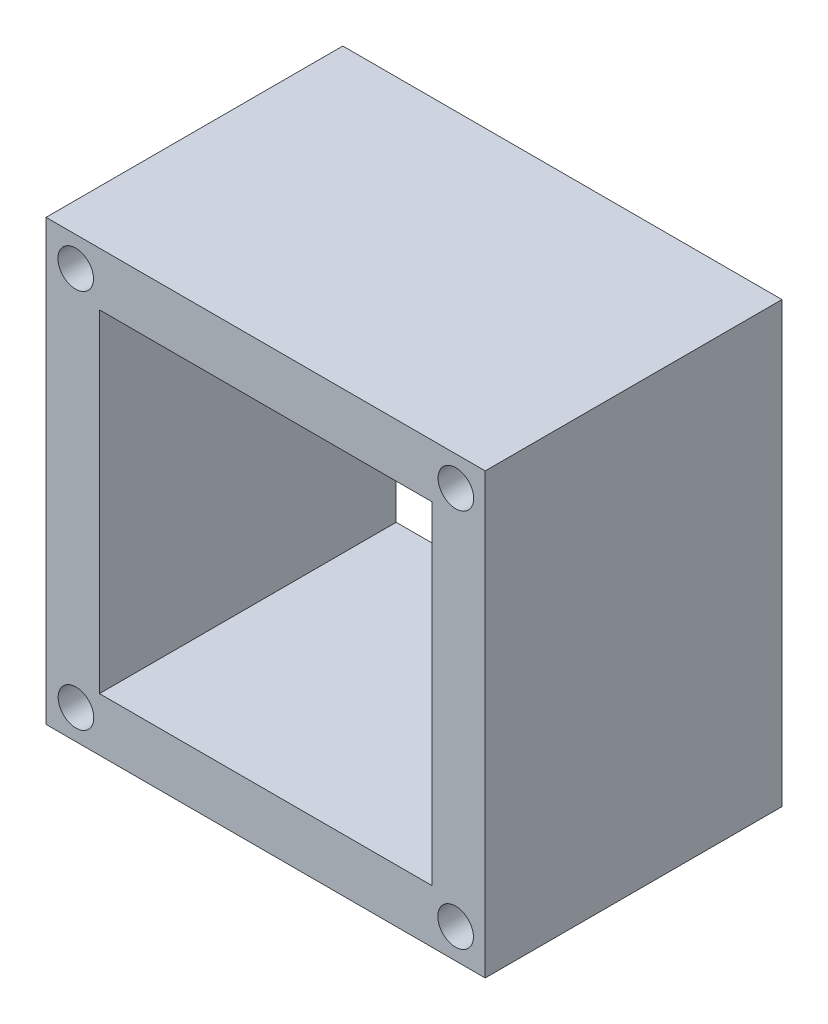
ISO-10303-21;
HEADER;
FILE_DESCRIPTION(('STEP AP214'),'2;1');
FILE_NAME('part.step','',(''),(''),'','','');
FILE_SCHEMA(('AUTOMOTIVE_DESIGN { 1 0 10303 214 1 1 1 1 }'));
ENDSEC;
DATA;
#1=APPLICATION_CONTEXT('core data for automotive mechanical design processes');
#2=APPLICATION_PROTOCOL_DEFINITION('international standard','automotive_design',2000,#1);
#3=PRODUCT_CONTEXT('',#1,'mechanical');
#4=PRODUCT('Part','Part','',(#3));
#5=PRODUCT_RELATED_PRODUCT_CATEGORY('part','',(#4));
#6=PRODUCT_DEFINITION_FORMATION('','',#4);
#7=PRODUCT_DEFINITION_CONTEXT('part definition',#1,'design');
#8=PRODUCT_DEFINITION('design','',#6,#7);
#9=PRODUCT_DEFINITION_SHAPE('','',#8);
#10=(LENGTH_UNIT() NAMED_UNIT(*) SI_UNIT(.MILLI.,.METRE.));
#11=(NAMED_UNIT(*) PLANE_ANGLE_UNIT() SI_UNIT($,.RADIAN.));
#12=(NAMED_UNIT(*) SI_UNIT($,.STERADIAN.) SOLID_ANGLE_UNIT());
#13=UNCERTAINTY_MEASURE_WITH_UNIT(LENGTH_MEASURE(1.E-05),#10,'distance_accuracy_value','');
#14=(GEOMETRIC_REPRESENTATION_CONTEXT(3) GLOBAL_UNCERTAINTY_ASSIGNED_CONTEXT((#13)) GLOBAL_UNIT_ASSIGNED_CONTEXT((#10,
#11,#12)) REPRESENTATION_CONTEXT('',''));
#15=CARTESIAN_POINT('',(0.,0.,0.));
#16=DIRECTION('',(0.,0.,1.));
#17=DIRECTION('',(1.,0.,0.));
#18=AXIS2_PLACEMENT_3D('',#15,#16,#17);
#19=CARTESIAN_POINT('',(-18.5,18.5,25.));
#20=DIRECTION('',(1.,0.,0.));
#21=DIRECTION('',(0.,1.,0.));
#22=AXIS2_PLACEMENT_3D('',#19,#20,#21);
#23=PLANE('',#22);
#24=DIRECTION('',(0.,-1.,0.));
#25=VECTOR('',#24,1.);
#26=CARTESIAN_POINT('',(-18.5,18.5,0.));
#27=LINE('',#26,#25);
#28=CARTESIAN_POINT('',(-18.5,18.5,0.));
#29=VERTEX_POINT('',#28);
#30=CARTESIAN_POINT('',(-18.5,-18.5,0.));
#31=VERTEX_POINT('',#30);
#32=EDGE_CURVE('E138',#29,#31,#27,.T.);
#33=ORIENTED_EDGE('',*,*,#32,.T.);
#34=DIRECTION('',(0.,0.,-1.));
#35=VECTOR('',#34,1.);
#36=CARTESIAN_POINT('',(-18.5,-18.5,25.));
#37=LINE('',#36,#35);
#38=CARTESIAN_POINT('',(-18.5,-18.5,25.));
#39=VERTEX_POINT('',#38);
#40=EDGE_CURVE('E11',#39,#31,#37,.T.);
#41=ORIENTED_EDGE('',*,*,#40,.F.);
#42=DIRECTION('',(0.,-1.,0.));
#43=VECTOR('',#42,1.);
#44=CARTESIAN_POINT('',(-18.5,18.5,25.));
#45=LINE('',#44,#43);
#46=CARTESIAN_POINT('',(-18.5,18.5,25.));
#47=VERTEX_POINT('',#46);
#48=EDGE_CURVE('E142',#47,#39,#45,.T.);
#49=ORIENTED_EDGE('',*,*,#48,.F.);
#50=DIRECTION('',(0.,0.,-1.));
#51=VECTOR('',#50,1.);
#52=CARTESIAN_POINT('',(-18.5,18.5,25.));
#53=LINE('',#52,#51);
#54=EDGE_CURVE('E154',#47,#29,#53,.T.);
#55=ORIENTED_EDGE('',*,*,#54,.T.);
#56=EDGE_LOOP('',(#33,#41,#49,#55));
#57=FACE_BOUND('',#56,.T.);
#58=ADVANCED_FACE('F37',(#57),#23,.F.);
#59=CARTESIAN_POINT('',(-18.5,-18.5,25.));
#60=DIRECTION('',(0.,1.,0.));
#61=DIRECTION('',(0.,0.,1.));
#62=AXIS2_PLACEMENT_3D('',#59,#60,#61);
#63=PLANE('',#62);
#64=DIRECTION('',(1.,0.,0.));
#65=VECTOR('',#64,1.);
#66=CARTESIAN_POINT('',(-18.5,-18.5,0.));
#67=LINE('',#66,#65);
#68=CARTESIAN_POINT('',(18.5,-18.5,0.));
#69=VERTEX_POINT('',#68);
#70=EDGE_CURVE('E157',#31,#69,#67,.T.);
#71=ORIENTED_EDGE('',*,*,#70,.T.);
#72=DIRECTION('',(0.,0.,-1.));
#73=VECTOR('',#72,1.);
#74=CARTESIAN_POINT('',(18.5,-18.5,25.));
#75=LINE('',#74,#73);
#76=CARTESIAN_POINT('',(18.5,-18.5,25.));
#77=VERTEX_POINT('',#76);
#78=EDGE_CURVE('E44',#77,#69,#75,.T.);
#79=ORIENTED_EDGE('',*,*,#78,.F.);
#80=DIRECTION('',(1.,0.,0.));
#81=VECTOR('',#80,1.);
#82=CARTESIAN_POINT('',(-18.5,-18.5,25.));
#83=LINE('',#82,#81);
#84=EDGE_CURVE('E145',#39,#77,#83,.T.);
#85=ORIENTED_EDGE('',*,*,#84,.F.);
#86=ORIENTED_EDGE('',*,*,#40,.T.);
#87=EDGE_LOOP('',(#71,#79,#85,#86));
#88=FACE_BOUND('',#87,.T.);
#89=ADVANCED_FACE('F173',(#88),#63,.F.);
#90=CARTESIAN_POINT('',(18.5,18.5,25.));
#91=DIRECTION('',(1.,0.,0.));
#92=DIRECTION('',(0.,0.,-1.));
#93=AXIS2_PLACEMENT_3D('',#90,#91,#92);
#94=PLANE('',#93);
#95=DIRECTION('',(0.,-1.,0.));
#96=VECTOR('',#95,1.);
#97=CARTESIAN_POINT('',(18.5,18.5,0.));
#98=LINE('',#97,#96);
#99=CARTESIAN_POINT('',(18.5,18.5,0.));
#100=VERTEX_POINT('',#99);
#101=EDGE_CURVE('E160',#100,#69,#98,.T.);
#102=ORIENTED_EDGE('',*,*,#101,.F.);
#103=DIRECTION('',(0.,0.,-1.));
#104=VECTOR('',#103,1.);
#105=CARTESIAN_POINT('',(18.5,18.5,25.));
#106=LINE('',#105,#104);
#107=CARTESIAN_POINT('',(18.5,18.5,25.));
#108=VERTEX_POINT('',#107);
#109=EDGE_CURVE('E166',#108,#100,#106,.T.);
#110=ORIENTED_EDGE('',*,*,#109,.F.);
#111=DIRECTION('',(0.,-1.,0.));
#112=VECTOR('',#111,1.);
#113=CARTESIAN_POINT('',(18.5,18.5,25.));
#114=LINE('',#113,#112);
#115=EDGE_CURVE('E148',#108,#77,#114,.T.);
#116=ORIENTED_EDGE('',*,*,#115,.T.);
#117=ORIENTED_EDGE('',*,*,#78,.T.);
#118=EDGE_LOOP('',(#102,#110,#116,#117));
#119=FACE_BOUND('',#118,.T.);
#120=ADVANCED_FACE('F170',(#119),#94,.T.);
#121=CARTESIAN_POINT('',(-18.5,18.5,25.));
#122=DIRECTION('',(0.,1.,0.));
#123=DIRECTION('',(0.,0.,1.));
#124=AXIS2_PLACEMENT_3D('',#121,#122,#123);
#125=PLANE('',#124);
#126=DIRECTION('',(1.,0.,0.));
#127=VECTOR('',#126,1.);
#128=CARTESIAN_POINT('',(-18.5,18.5,0.));
#129=LINE('',#128,#127);
#130=EDGE_CURVE('E146',#29,#100,#129,.T.);
#131=ORIENTED_EDGE('',*,*,#130,.F.);
#132=ORIENTED_EDGE('',*,*,#54,.F.);
#133=DIRECTION('',(1.,0.,0.));
#134=VECTOR('',#133,1.);
#135=CARTESIAN_POINT('',(-18.5,18.5,25.));
#136=LINE('',#135,#134);
#137=EDGE_CURVE('E151',#47,#108,#136,.T.);
#138=ORIENTED_EDGE('',*,*,#137,.T.);
#139=ORIENTED_EDGE('',*,*,#109,.T.);
#140=EDGE_LOOP('',(#131,#132,#138,#139));
#141=FACE_BOUND('',#140,.T.);
#142=ADVANCED_FACE('F178',(#141),#125,.T.);
#143=CARTESIAN_POINT('',(0.,0.,25.));
#144=DIRECTION('',(0.,0.,1.));
#145=DIRECTION('',(1.,0.,0.));
#146=AXIS2_PLACEMENT_3D('',#143,#144,#145);
#147=PLANE('',#146);
#148=CARTESIAN_POINT('',(-15.9787840043898,-16.0039338204186,25.));
#149=DIRECTION('',(0.,0.,1.));
#150=DIRECTION('',(1.,0.,0.));
#151=AXIS2_PLACEMENT_3D('',#148,#149,#150);
#152=CIRCLE('',#151,1.5);
#153=CARTESIAN_POINT('',(-14.4787840043898,-16.0039338204186,25.));
#154=VERTEX_POINT('',#153);
#155=EDGE_CURVE('E247',#154,#154,#152,.T.);
#156=ORIENTED_EDGE('',*,*,#155,.F.);
#157=EDGE_LOOP('',(#156));
#158=FACE_BOUND('',#157,.T.);
#159=CARTESIAN_POINT('',(16.0034854120513,-15.9979475786357,25.));
#160=DIRECTION('',(0.,0.,1.));
#161=DIRECTION('',(1.,0.,0.));
#162=AXIS2_PLACEMENT_3D('',#159,#160,#161);
#163=CIRCLE('',#162,1.5);
#164=CARTESIAN_POINT('',(17.5034854120513,-15.9979475786357,25.));
#165=VERTEX_POINT('',#164);
#166=EDGE_CURVE('E239',#165,#165,#163,.T.);
#167=ORIENTED_EDGE('',*,*,#166,.F.);
#168=EDGE_LOOP('',(#167));
#169=FACE_BOUND('',#168,.T.);
#170=CARTESIAN_POINT('',(16.0272817652322,15.9947135075899,25.));
#171=DIRECTION('',(0.,0.,1.));
#172=DIRECTION('',(1.,0.,0.));
#173=AXIS2_PLACEMENT_3D('',#170,#171,#172);
#174=CIRCLE('',#173,1.5);
#175=CARTESIAN_POINT('',(17.5272817652322,15.9947135075899,25.));
#176=VERTEX_POINT('',#175);
#177=EDGE_CURVE('E235',#176,#176,#174,.T.);
#178=ORIENTED_EDGE('',*,*,#177,.F.);
#179=EDGE_LOOP('',(#178));
#180=FACE_BOUND('',#179,.T.);
#181=CARTESIAN_POINT('',(-16.0039130624115,16.0039130624115,25.));
#182=DIRECTION('',(0.,0.,1.));
#183=DIRECTION('',(1.,0.,0.));
#184=AXIS2_PLACEMENT_3D('',#181,#182,#183);
#185=CIRCLE('',#184,1.5);
#186=CARTESIAN_POINT('',(-14.5039130624115,16.0039130624115,25.));
#187=VERTEX_POINT('',#186);
#188=EDGE_CURVE('E125',#187,#187,#185,.T.);
#189=ORIENTED_EDGE('',*,*,#188,.F.);
#190=EDGE_LOOP('',(#189));
#191=FACE_BOUND('',#190,.T.);
#192=DIRECTION('',(0.,1.,0.));
#193=VECTOR('',#192,1.);
#194=CARTESIAN_POINT('',(14.,14.,25.));
#195=LINE('',#194,#193);
#196=CARTESIAN_POINT('',(14.,-14.,25.));
#197=VERTEX_POINT('',#196);
#198=CARTESIAN_POINT('',(14.,14.,25.));
#199=VERTEX_POINT('',#198);
#200=EDGE_CURVE('E51',#197,#199,#195,.T.);
#201=ORIENTED_EDGE('',*,*,#200,.F.);
#202=DIRECTION('',(1.,0.,0.));
#203=VECTOR('',#202,1.);
#204=CARTESIAN_POINT('',(-14.,-14.,25.));
#205=LINE('',#204,#203);
#206=CARTESIAN_POINT('',(-14.,-14.,25.));
#207=VERTEX_POINT('',#206);
#208=EDGE_CURVE('E119',#207,#197,#205,.T.);
#209=ORIENTED_EDGE('',*,*,#208,.F.);
#210=DIRECTION('',(0.,-1.,0.));
#211=VECTOR('',#210,1.);
#212=CARTESIAN_POINT('',(-14.,14.,25.));
#213=LINE('',#212,#211);
#214=CARTESIAN_POINT('',(-14.,14.,25.));
#215=VERTEX_POINT('',#214);
#216=EDGE_CURVE('E122',#215,#207,#213,.T.);
#217=ORIENTED_EDGE('',*,*,#216,.F.);
#218=DIRECTION('',(-1.,0.,0.));
#219=VECTOR('',#218,1.);
#220=CARTESIAN_POINT('',(-14.,14.,25.));
#221=LINE('',#220,#219);
#222=EDGE_CURVE('E131',#199,#215,#221,.T.);
#223=ORIENTED_EDGE('',*,*,#222,.F.);
#224=EDGE_LOOP('',(#201,#209,#217,#223));
#225=FACE_BOUND('',#224,.T.);
#226=ORIENTED_EDGE('',*,*,#48,.T.);
#227=ORIENTED_EDGE('',*,*,#84,.T.);
#228=ORIENTED_EDGE('',*,*,#115,.F.);
#229=ORIENTED_EDGE('',*,*,#137,.F.);
#230=EDGE_LOOP('',(#226,#227,#228,#229));
#231=FACE_BOUND('',#230,.T.);
#232=ADVANCED_FACE('F182',(#158,#169,#180,#191,#225,#231),#147,.T.);
#233=CARTESIAN_POINT('',(0.,0.,0.));
#234=DIRECTION('',(0.,0.,1.));
#235=DIRECTION('',(1.,0.,0.));
#236=AXIS2_PLACEMENT_3D('',#233,#234,#235);
#237=PLANE('',#236);
#238=CARTESIAN_POINT('',(-15.9787840043898,-16.0039338204186,0.));
#239=DIRECTION('',(0.,0.,1.));
#240=DIRECTION('',(1.,0.,0.));
#241=AXIS2_PLACEMENT_3D('',#238,#239,#240);
#242=CIRCLE('',#241,1.5);
#243=CARTESIAN_POINT('',(-14.4787840043898,-16.0039338204186,0.));
#244=VERTEX_POINT('',#243);
#245=EDGE_CURVE('E250',#244,#244,#242,.T.);
#246=ORIENTED_EDGE('',*,*,#245,.T.);
#247=EDGE_LOOP('',(#246));
#248=FACE_BOUND('',#247,.T.);
#249=CARTESIAN_POINT('',(16.0034854120513,-15.9979475786357,0.));
#250=DIRECTION('',(0.,0.,1.));
#251=DIRECTION('',(1.,0.,0.));
#252=AXIS2_PLACEMENT_3D('',#249,#250,#251);
#253=CIRCLE('',#252,1.5);
#254=CARTESIAN_POINT('',(17.5034854120513,-15.9979475786357,0.));
#255=VERTEX_POINT('',#254);
#256=EDGE_CURVE('E244',#255,#255,#253,.T.);
#257=ORIENTED_EDGE('',*,*,#256,.T.);
#258=EDGE_LOOP('',(#257));
#259=FACE_BOUND('',#258,.T.);
#260=CARTESIAN_POINT('',(16.0272817652322,15.9947135075899,0.));
#261=DIRECTION('',(0.,0.,1.));
#262=DIRECTION('',(1.,0.,0.));
#263=AXIS2_PLACEMENT_3D('',#260,#261,#262);
#264=CIRCLE('',#263,1.5);
#265=CARTESIAN_POINT('',(17.5272817652322,15.9947135075899,0.));
#266=VERTEX_POINT('',#265);
#267=EDGE_CURVE('E232',#266,#266,#264,.T.);
#268=ORIENTED_EDGE('',*,*,#267,.T.);
#269=EDGE_LOOP('',(#268));
#270=FACE_BOUND('',#269,.T.);
#271=CARTESIAN_POINT('',(-16.0039130624115,16.0039130624115,0.));
#272=DIRECTION('',(0.,0.,1.));
#273=DIRECTION('',(1.,0.,0.));
#274=AXIS2_PLACEMENT_3D('',#271,#272,#273);
#275=CIRCLE('',#274,1.5);
#276=CARTESIAN_POINT('',(-14.5039130624115,16.0039130624115,0.));
#277=VERTEX_POINT('',#276);
#278=EDGE_CURVE('E132',#277,#277,#275,.T.);
#279=ORIENTED_EDGE('',*,*,#278,.T.);
#280=EDGE_LOOP('',(#279));
#281=FACE_BOUND('',#280,.T.);
#282=DIRECTION('',(1.,0.,0.));
#283=VECTOR('',#282,1.);
#284=CARTESIAN_POINT('',(-14.,-14.,0.));
#285=LINE('',#284,#283);
#286=CARTESIAN_POINT('',(-14.,-14.,0.));
#287=VERTEX_POINT('',#286);
#288=CARTESIAN_POINT('',(14.,-14.,0.));
#289=VERTEX_POINT('',#288);
#290=EDGE_CURVE('E109',#287,#289,#285,.T.);
#291=ORIENTED_EDGE('',*,*,#290,.T.);
#292=DIRECTION('',(0.,1.,0.));
#293=VECTOR('',#292,1.);
#294=CARTESIAN_POINT('',(14.,14.,0.));
#295=LINE('',#294,#293);
#296=CARTESIAN_POINT('',(14.,14.,0.));
#297=VERTEX_POINT('',#296);
#298=EDGE_CURVE('E103',#289,#297,#295,.T.);
#299=ORIENTED_EDGE('',*,*,#298,.T.);
#300=DIRECTION('',(-1.,0.,0.));
#301=VECTOR('',#300,1.);
#302=CARTESIAN_POINT('',(-14.,14.,0.));
#303=LINE('',#302,#301);
#304=CARTESIAN_POINT('',(-14.,14.,0.));
#305=VERTEX_POINT('',#304);
#306=EDGE_CURVE('E112',#297,#305,#303,.T.);
#307=ORIENTED_EDGE('',*,*,#306,.T.);
#308=DIRECTION('',(0.,-1.,0.));
#309=VECTOR('',#308,1.);
#310=CARTESIAN_POINT('',(-14.,14.,0.));
#311=LINE('',#310,#309);
#312=EDGE_CURVE('E59',#305,#287,#311,.T.);
#313=ORIENTED_EDGE('',*,*,#312,.T.);
#314=EDGE_LOOP('',(#291,#299,#307,#313));
#315=FACE_BOUND('',#314,.T.);
#316=ORIENTED_EDGE('',*,*,#32,.F.);
#317=ORIENTED_EDGE('',*,*,#130,.T.);
#318=ORIENTED_EDGE('',*,*,#101,.T.);
#319=ORIENTED_EDGE('',*,*,#70,.F.);
#320=EDGE_LOOP('',(#316,#317,#318,#319));
#321=FACE_BOUND('',#320,.T.);
#322=ADVANCED_FACE('F116',(#248,#259,#270,#281,#315,#321),#237,.F.);
#323=CARTESIAN_POINT('',(14.,14.,0.));
#324=DIRECTION('',(1.,0.,0.));
#325=DIRECTION('',(0.,1.,0.));
#326=AXIS2_PLACEMENT_3D('',#323,#324,#325);
#327=PLANE('',#326);
#328=ORIENTED_EDGE('',*,*,#200,.T.);
#329=DIRECTION('',(0.,0.,1.));
#330=VECTOR('',#329,1.);
#331=CARTESIAN_POINT('',(14.,14.,0.));
#332=LINE('',#331,#330);
#333=EDGE_CURVE('E99',#297,#199,#332,.T.);
#334=ORIENTED_EDGE('',*,*,#333,.F.);
#335=ORIENTED_EDGE('',*,*,#298,.F.);
#336=DIRECTION('',(0.,0.,1.));
#337=VECTOR('',#336,1.);
#338=CARTESIAN_POINT('',(14.,-14.,0.));
#339=LINE('',#338,#337);
#340=EDGE_CURVE('E136',#289,#197,#339,.T.);
#341=ORIENTED_EDGE('',*,*,#340,.T.);
#342=EDGE_LOOP('',(#328,#334,#335,#341));
#343=FACE_BOUND('',#342,.T.);
#344=ADVANCED_FACE('F101',(#343),#327,.F.);
#345=CARTESIAN_POINT('',(-14.,-14.,0.));
#346=DIRECTION('',(0.,-1.,0.));
#347=DIRECTION('',(0.,0.,-1.));
#348=AXIS2_PLACEMENT_3D('',#345,#346,#347);
#349=PLANE('',#348);
#350=ORIENTED_EDGE('',*,*,#208,.T.);
#351=ORIENTED_EDGE('',*,*,#340,.F.);
#352=ORIENTED_EDGE('',*,*,#290,.F.);
#353=DIRECTION('',(0.,0.,1.));
#354=VECTOR('',#353,1.);
#355=CARTESIAN_POINT('',(-14.,-14.,0.));
#356=LINE('',#355,#354);
#357=EDGE_CURVE('E139',#287,#207,#356,.T.);
#358=ORIENTED_EDGE('',*,*,#357,.T.);
#359=EDGE_LOOP('',(#350,#351,#352,#358));
#360=FACE_BOUND('',#359,.T.);
#361=ADVANCED_FACE('F203',(#360),#349,.F.);
#362=CARTESIAN_POINT('',(-14.,14.,0.));
#363=DIRECTION('',(-1.,0.,0.));
#364=DIRECTION('',(0.,-1.,0.));
#365=AXIS2_PLACEMENT_3D('',#362,#363,#364);
#366=PLANE('',#365);
#367=ORIENTED_EDGE('',*,*,#216,.T.);
#368=ORIENTED_EDGE('',*,*,#357,.F.);
#369=ORIENTED_EDGE('',*,*,#312,.F.);
#370=DIRECTION('',(0.,0.,1.));
#371=VECTOR('',#370,1.);
#372=CARTESIAN_POINT('',(-14.,14.,0.));
#373=LINE('',#372,#371);
#374=EDGE_CURVE('E108',#305,#215,#373,.T.);
#375=ORIENTED_EDGE('',*,*,#374,.T.);
#376=EDGE_LOOP('',(#367,#368,#369,#375));
#377=FACE_BOUND('',#376,.T.);
#378=ADVANCED_FACE('F207',(#377),#366,.F.);
#379=CARTESIAN_POINT('',(-14.,14.,0.));
#380=DIRECTION('',(0.,1.,0.));
#381=DIRECTION('',(0.,0.,1.));
#382=AXIS2_PLACEMENT_3D('',#379,#380,#381);
#383=PLANE('',#382);
#384=ORIENTED_EDGE('',*,*,#222,.T.);
#385=ORIENTED_EDGE('',*,*,#374,.F.);
#386=ORIENTED_EDGE('',*,*,#306,.F.);
#387=ORIENTED_EDGE('',*,*,#333,.T.);
#388=EDGE_LOOP('',(#384,#385,#386,#387));
#389=FACE_BOUND('',#388,.T.);
#390=ADVANCED_FACE('F113',(#389),#383,.F.);
#391=CARTESIAN_POINT('',(-16.0039130624115,16.0039130624115,0.));
#392=DIRECTION('',(0.,0.,1.));
#393=DIRECTION('',(1.,0.,0.));
#394=AXIS2_PLACEMENT_3D('',#391,#392,#393);
#395=CYLINDRICAL_SURFACE('',#394,1.5);
#396=ORIENTED_EDGE('',*,*,#278,.F.);
#397=EDGE_LOOP('',(#396));
#398=FACE_BOUND('',#397,.T.);
#399=ORIENTED_EDGE('',*,*,#188,.T.);
#400=EDGE_LOOP('',(#399));
#401=FACE_BOUND('',#400,.T.);
#402=ADVANCED_FACE('F206',(#398,#401),#395,.F.);
#403=CARTESIAN_POINT('',(16.0272817652322,15.9947135075899,0.));
#404=DIRECTION('',(0.,0.,1.));
#405=DIRECTION('',(1.,0.,0.));
#406=AXIS2_PLACEMENT_3D('',#403,#404,#405);
#407=CYLINDRICAL_SURFACE('',#406,1.5);
#408=ORIENTED_EDGE('',*,*,#267,.F.);
#409=EDGE_LOOP('',(#408));
#410=FACE_BOUND('',#409,.T.);
#411=ORIENTED_EDGE('',*,*,#177,.T.);
#412=EDGE_LOOP('',(#411));
#413=FACE_BOUND('',#412,.T.);
#414=ADVANCED_FACE('F215',(#410,#413),#407,.F.);
#415=CARTESIAN_POINT('',(16.0034854120513,-15.9979475786357,0.));
#416=DIRECTION('',(0.,0.,1.));
#417=DIRECTION('',(1.,0.,0.));
#418=AXIS2_PLACEMENT_3D('',#415,#416,#417);
#419=CYLINDRICAL_SURFACE('',#418,1.5);
#420=ORIENTED_EDGE('',*,*,#256,.F.);
#421=EDGE_LOOP('',(#420));
#422=FACE_BOUND('',#421,.T.);
#423=ORIENTED_EDGE('',*,*,#166,.T.);
#424=EDGE_LOOP('',(#423));
#425=FACE_BOUND('',#424,.T.);
#426=ADVANCED_FACE('F220',(#422,#425),#419,.F.);
#427=CARTESIAN_POINT('',(-15.9787840043898,-16.0039338204186,0.));
#428=DIRECTION('',(0.,0.,1.));
#429=DIRECTION('',(1.,0.,0.));
#430=AXIS2_PLACEMENT_3D('',#427,#428,#429);
#431=CYLINDRICAL_SURFACE('',#430,1.5);
#432=ORIENTED_EDGE('',*,*,#245,.F.);
#433=EDGE_LOOP('',(#432));
#434=FACE_BOUND('',#433,.T.);
#435=ORIENTED_EDGE('',*,*,#155,.T.);
#436=EDGE_LOOP('',(#435));
#437=FACE_BOUND('',#436,.T.);
#438=ADVANCED_FACE('F217',(#434,#437),#431,.F.);
#439=CLOSED_SHELL('',(#58,#89,#120,#142,#232,#322,#344,#361,#378,#390,#402,#414,#426,#438));
#440=MANIFOLD_SOLID_BREP('B2',#439);
#441=ADVANCED_BREP_SHAPE_REPRESENTATION('',(#18,#440),#14);
#442=SHAPE_DEFINITION_REPRESENTATION(#9,#441);
ENDSEC;
END-ISO-10303-21;
